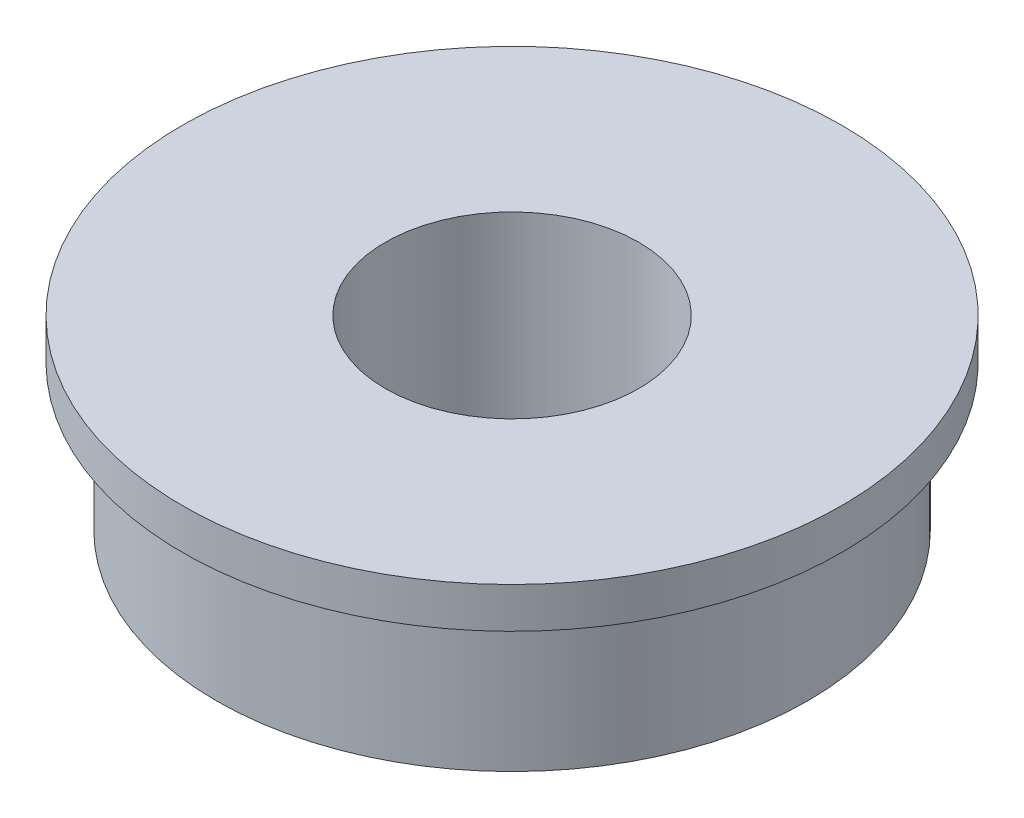
ISO-10303-21;
HEADER;
FILE_DESCRIPTION(('STEP AP214'),'2;1');
FILE_NAME('part.step','',(''),(''),'','','');
FILE_SCHEMA(('AUTOMOTIVE_DESIGN { 1 0 10303 214 1 1 1 1 }'));
ENDSEC;
DATA;
#1=APPLICATION_CONTEXT('core data for automotive mechanical design processes');
#2=APPLICATION_PROTOCOL_DEFINITION('international standard','automotive_design',2000,#1);
#3=PRODUCT_CONTEXT('',#1,'mechanical');
#4=PRODUCT('Part','Part','',(#3));
#5=PRODUCT_RELATED_PRODUCT_CATEGORY('part','',(#4));
#6=PRODUCT_DEFINITION_FORMATION('','',#4);
#7=PRODUCT_DEFINITION_CONTEXT('part definition',#1,'design');
#8=PRODUCT_DEFINITION('design','',#6,#7);
#9=PRODUCT_DEFINITION_SHAPE('','',#8);
#10=(LENGTH_UNIT() NAMED_UNIT(*) SI_UNIT(.MILLI.,.METRE.));
#11=(NAMED_UNIT(*) PLANE_ANGLE_UNIT() SI_UNIT($,.RADIAN.));
#12=(NAMED_UNIT(*) SI_UNIT($,.STERADIAN.) SOLID_ANGLE_UNIT());
#13=UNCERTAINTY_MEASURE_WITH_UNIT(LENGTH_MEASURE(1.E-05),#10,'distance_accuracy_value','');
#14=(GEOMETRIC_REPRESENTATION_CONTEXT(3) GLOBAL_UNCERTAINTY_ASSIGNED_CONTEXT((#13)) GLOBAL_UNIT_ASSIGNED_CONTEXT((#10,
#11,#12)) REPRESENTATION_CONTEXT('',''));
#15=CARTESIAN_POINT('',(0.,0.,0.));
#16=DIRECTION('',(0.,0.,1.));
#17=DIRECTION('',(1.,0.,0.));
#18=AXIS2_PLACEMENT_3D('',#15,#16,#17);
#19=CARTESIAN_POINT('',(-11.5886380489201,5.461,0.));
#20=DIRECTION('',(0.,-1.,0.));
#21=DIRECTION('',(0.,0.,-1.));
#22=AXIS2_PLACEMENT_3D('',#19,#20,#21);
#23=CYLINDRICAL_SURFACE('',#22,11.1125);
#24=CARTESIAN_POINT('',(-11.5886380489201,5.461,0.));
#25=DIRECTION('',(0.,1.,0.));
#26=DIRECTION('',(0.,0.,1.));
#27=AXIS2_PLACEMENT_3D('',#24,#25,#26);
#28=CIRCLE('',#27,11.1125);
#29=CARTESIAN_POINT('',(-11.5886380489201,5.461,11.1125));
#30=VERTEX_POINT('',#29);
#31=EDGE_CURVE('E10',#30,#30,#28,.T.);
#32=ORIENTED_EDGE('',*,*,#31,.F.);
#33=EDGE_LOOP('',(#32));
#34=FACE_BOUND('',#33,.T.);
#35=CARTESIAN_POINT('',(-11.5886380489201,0.,0.));
#36=DIRECTION('',(0.,1.,0.));
#37=DIRECTION('',(0.,0.,1.));
#38=AXIS2_PLACEMENT_3D('',#35,#36,#37);
#39=CIRCLE('',#38,11.1125);
#40=CARTESIAN_POINT('',(-11.5886380489201,0.,11.1125));
#41=VERTEX_POINT('',#40);
#42=EDGE_CURVE('E34',#41,#41,#39,.T.);
#43=ORIENTED_EDGE('',*,*,#42,.T.);
#44=EDGE_LOOP('',(#43));
#45=FACE_BOUND('',#44,.T.);
#46=ADVANCED_FACE('F31',(#34,#45),#23,.T.);
#47=CARTESIAN_POINT('',(-11.5886380489201,0.,0.));
#48=DIRECTION('',(0.,1.,0.));
#49=DIRECTION('',(0.,0.,1.));
#50=AXIS2_PLACEMENT_3D('',#47,#48,#49);
#51=PLANE('',#50);
#52=CARTESIAN_POINT('',(-11.5886380489201,0.,0.));
#53=DIRECTION('',(0.,1.,0.));
#54=DIRECTION('',(0.,0.,1.));
#55=AXIS2_PLACEMENT_3D('',#52,#53,#54);
#56=CIRCLE('',#55,4.7625);
#57=CARTESIAN_POINT('',(-11.5886380489201,0.,4.7625));
#58=VERTEX_POINT('',#57);
#59=EDGE_CURVE('E46',#58,#58,#56,.T.);
#60=ORIENTED_EDGE('',*,*,#59,.T.);
#61=EDGE_LOOP('',(#60));
#62=FACE_BOUND('',#61,.T.);
#63=ORIENTED_EDGE('',*,*,#42,.F.);
#64=EDGE_LOOP('',(#63));
#65=FACE_BOUND('',#64,.T.);
#66=ADVANCED_FACE('F72',(#62,#65),#51,.F.);
#67=CARTESIAN_POINT('',(-11.5886380489201,5.461,0.));
#68=DIRECTION('',(0.,1.,0.));
#69=DIRECTION('',(0.,0.,1.));
#70=AXIS2_PLACEMENT_3D('',#67,#68,#69);
#71=PLANE('',#70);
#72=CARTESIAN_POINT('',(-11.5886380489201,5.461,0.));
#73=DIRECTION('',(0.,1.,0.));
#74=DIRECTION('',(0.,0.,1.));
#75=AXIS2_PLACEMENT_3D('',#72,#73,#74);
#76=CIRCLE('',#75,12.3825);
#77=CARTESIAN_POINT('',(-11.5886380489201,5.461,-12.3825));
#78=VERTEX_POINT('',#77);
#79=EDGE_CURVE('E43',#78,#78,#76,.T.);
#80=ORIENTED_EDGE('',*,*,#79,.F.);
#81=EDGE_LOOP('',(#80));
#82=FACE_BOUND('',#81,.T.);
#83=ORIENTED_EDGE('',*,*,#31,.T.);
#84=EDGE_LOOP('',(#83));
#85=FACE_BOUND('',#84,.T.);
#86=ADVANCED_FACE('F67',(#82,#85),#71,.F.);
#87=CARTESIAN_POINT('',(-11.5886380489201,6.985,0.));
#88=DIRECTION('',(0.,-1.,0.));
#89=DIRECTION('',(0.,0.,-1.));
#90=AXIS2_PLACEMENT_3D('',#87,#88,#89);
#91=CYLINDRICAL_SURFACE('',#90,12.3825);
#92=CARTESIAN_POINT('',(-11.5886380489201,6.985,0.));
#93=DIRECTION('',(0.,1.,0.));
#94=DIRECTION('',(0.,0.,1.));
#95=AXIS2_PLACEMENT_3D('',#92,#93,#94);
#96=CIRCLE('',#95,12.3825);
#97=CARTESIAN_POINT('',(-11.5886380489201,6.985,-12.3825));
#98=VERTEX_POINT('',#97);
#99=EDGE_CURVE('E41',#98,#98,#96,.T.);
#100=CARTESIAN_POINT('',(-11.5886380489201,6.985,-12.3825));
#101=CARTESIAN_POINT('',(-11.5886380489201,6.969125,-12.3825));
#102=CARTESIAN_POINT('',(-11.5886380489201,6.95325,-12.3825));
#103=CARTESIAN_POINT('',(-11.5886380489201,6.9215,-12.3825));
#104=CARTESIAN_POINT('',(-11.5886380489201,6.905625,-12.3825));
#105=CARTESIAN_POINT('',(-11.5886380489201,6.873875,-12.3825));
#106=CARTESIAN_POINT('',(-11.5886380489201,6.858,-12.3825));
#107=CARTESIAN_POINT('',(-11.5886380489201,6.82625,-12.3825));
#108=CARTESIAN_POINT('',(-11.5886380489201,6.810375,-12.3825));
#109=CARTESIAN_POINT('',(-11.5886380489201,6.778625,-12.3825));
#110=CARTESIAN_POINT('',(-11.5886380489201,6.76275,-12.3825));
#111=CARTESIAN_POINT('',(-11.5886380489201,6.731,-12.3825));
#112=CARTESIAN_POINT('',(-11.5886380489201,6.715125,-12.3825));
#113=CARTESIAN_POINT('',(-11.5886380489201,6.683375,-12.3825));
#114=CARTESIAN_POINT('',(-11.5886380489201,6.6675,-12.3825));
#115=CARTESIAN_POINT('',(-11.5886380489201,6.63575,-12.3825));
#116=CARTESIAN_POINT('',(-11.5886380489201,6.619875,-12.3825));
#117=CARTESIAN_POINT('',(-11.5886380489201,6.588125,-12.3825));
#118=CARTESIAN_POINT('',(-11.5886380489201,6.57225,-12.3825));
#119=CARTESIAN_POINT('',(-11.5886380489201,6.5405,-12.3825));
#120=CARTESIAN_POINT('',(-11.5886380489201,6.524625,-12.3825));
#121=CARTESIAN_POINT('',(-11.5886380489201,6.492875,-12.3825));
#122=CARTESIAN_POINT('',(-11.5886380489201,6.477,-12.3825));
#123=CARTESIAN_POINT('',(-11.5886380489201,6.44525,-12.3825));
#124=CARTESIAN_POINT('',(-11.5886380489201,6.429375,-12.3825));
#125=CARTESIAN_POINT('',(-11.5886380489201,6.397625,-12.3825));
#126=CARTESIAN_POINT('',(-11.5886380489201,6.38175,-12.3825));
#127=CARTESIAN_POINT('',(-11.5886380489201,6.35,-12.3825));
#128=CARTESIAN_POINT('',(-11.5886380489201,6.334125,-12.3825));
#129=CARTESIAN_POINT('',(-11.5886380489201,6.302375,-12.3825));
#130=CARTESIAN_POINT('',(-11.5886380489201,6.2865,-12.3825));
#131=CARTESIAN_POINT('',(-11.5886380489201,6.25475,-12.3825));
#132=CARTESIAN_POINT('',(-11.5886380489201,6.238875,-12.3825));
#133=CARTESIAN_POINT('',(-11.5886380489201,6.207125,-12.3825));
#134=CARTESIAN_POINT('',(-11.5886380489201,6.19125,-12.3825));
#135=CARTESIAN_POINT('',(-11.5886380489201,6.1595,-12.3825));
#136=CARTESIAN_POINT('',(-11.5886380489201,6.143625,-12.3825));
#137=CARTESIAN_POINT('',(-11.5886380489201,6.111875,-12.3825));
#138=CARTESIAN_POINT('',(-11.5886380489201,6.096,-12.3825));
#139=CARTESIAN_POINT('',(-11.5886380489201,6.06425,-12.3825));
#140=CARTESIAN_POINT('',(-11.5886380489201,6.048375,-12.3825));
#141=CARTESIAN_POINT('',(-11.5886380489201,6.016625,-12.3825));
#142=CARTESIAN_POINT('',(-11.5886380489201,6.00075,-12.3825));
#143=CARTESIAN_POINT('',(-11.5886380489201,5.969,-12.3825));
#144=CARTESIAN_POINT('',(-11.5886380489201,5.953125,-12.3825));
#145=CARTESIAN_POINT('',(-11.5886380489201,5.921375,-12.3825));
#146=CARTESIAN_POINT('',(-11.5886380489201,5.9055,-12.3825));
#147=CARTESIAN_POINT('',(-11.5886380489201,5.87375,-12.3825));
#148=CARTESIAN_POINT('',(-11.5886380489201,5.857875,-12.3825));
#149=CARTESIAN_POINT('',(-11.5886380489201,5.826125,-12.3825));
#150=CARTESIAN_POINT('',(-11.5886380489201,5.81025,-12.3825));
#151=CARTESIAN_POINT('',(-11.5886380489201,5.7785,-12.3825));
#152=CARTESIAN_POINT('',(-11.5886380489201,5.762625,-12.3825));
#153=CARTESIAN_POINT('',(-11.5886380489201,5.730875,-12.3825));
#154=CARTESIAN_POINT('',(-11.5886380489201,5.715,-12.3825));
#155=CARTESIAN_POINT('',(-11.5886380489201,5.68325,-12.3825));
#156=CARTESIAN_POINT('',(-11.5886380489201,5.667375,-12.3825));
#157=CARTESIAN_POINT('',(-11.5886380489201,5.635625,-12.3825));
#158=CARTESIAN_POINT('',(-11.5886380489201,5.61975,-12.3825));
#159=CARTESIAN_POINT('',(-11.5886380489201,5.588,-12.3825));
#160=CARTESIAN_POINT('',(-11.5886380489201,5.572125,-12.3825));
#161=CARTESIAN_POINT('',(-11.5886380489201,5.540375,-12.3825));
#162=CARTESIAN_POINT('',(-11.5886380489201,5.5245,-12.3825));
#163=CARTESIAN_POINT('',(-11.5886380489201,5.49275,-12.3825));
#164=CARTESIAN_POINT('',(-11.5886380489201,5.476875,-12.3825));
#165=CARTESIAN_POINT('',(-11.5886380489201,5.461,-12.3825));
#166=B_SPLINE_CURVE_WITH_KNOTS('',3,(#100,#101,#102,#103,#104,#105,#106,#107,#108,#109,#110,
#111,#112,#113,#114,#115,#116,#117,#118,#119,#120,#121,#122,#123,#124,#125,#126,#127,#128,#129,
#130,#131,#132,#133,#134,#135,#136,#137,#138,#139,#140,#141,#142,#143,#144,#145,#146,#147,#148,
#149,#150,#151,#152,#153,#154,#155,#156,#157,#158,#159,#160,#161,#162,#163,#164,#165),
.UNSPECIFIED.,.F.,.F.,(4,2,2,2,2,2,2,2,2,2,2,2,2,2,2,2,2,2,2,2,2,2,2,2,2,2,2,2,2,2,2,2,4),(0.,
0.0476250000000008,0.0952500000000007,0.142875000000001,0.190500000000001,0.238125,0.28575,
0.333375,0.381,0.428625,0.47625,0.523875,0.571500000000001,0.619125000000001,0.666750000000001,
0.714375000000001,0.762000000000001,0.809625,0.85725,0.904875,0.9525,1.000125,1.04775,1.095375,
1.143,1.190625,1.23825,1.285875,1.3335,1.381125,1.42875,1.476375,1.524),.UNSPECIFIED.);
#167=EDGE_CURVE('BSEAM61',#98,#78,#166,.T.);
#168=ORIENTED_EDGE('',*,*,#99,.F.);
#169=ORIENTED_EDGE('',*,*,#79,.T.);
#170=ORIENTED_EDGE('',*,*,#167,.T.);
#171=ORIENTED_EDGE('',*,*,#167,.F.);
#172=EDGE_LOOP('',(#168,#170,#169,#171));
#173=FACE_BOUND('',#172,.T.);
#174=ADVANCED_FACE('F61',(#173),#91,.T.);
#175=CARTESIAN_POINT('',(-11.5886380489201,6.985,0.));
#176=DIRECTION('',(0.,1.,0.));
#177=DIRECTION('',(0.,0.,1.));
#178=AXIS2_PLACEMENT_3D('',#175,#176,#177);
#179=PLANE('',#178);
#180=CARTESIAN_POINT('',(-11.5886380489201,6.985,0.));
#181=DIRECTION('',(0.,1.,0.));
#182=DIRECTION('',(0.,0.,1.));
#183=AXIS2_PLACEMENT_3D('',#180,#181,#182);
#184=CIRCLE('',#183,4.7625);
#185=CARTESIAN_POINT('',(-11.5886380489201,6.985,4.7625));
#186=VERTEX_POINT('',#185);
#187=EDGE_CURVE('E51',#186,#186,#184,.T.);
#188=ORIENTED_EDGE('',*,*,#187,.F.);
#189=EDGE_LOOP('',(#188));
#190=FACE_BOUND('',#189,.T.);
#191=ORIENTED_EDGE('',*,*,#99,.T.);
#192=EDGE_LOOP('',(#191));
#193=FACE_BOUND('',#192,.T.);
#194=ADVANCED_FACE('F58',(#190,#193),#179,.T.);
#195=CARTESIAN_POINT('',(-11.5886380489201,-9.779,0.));
#196=DIRECTION('',(0.,1.,0.));
#197=DIRECTION('',(0.,0.,1.));
#198=AXIS2_PLACEMENT_3D('',#195,#196,#197);
#199=CYLINDRICAL_SURFACE('',#198,4.7625);
#200=ORIENTED_EDGE('',*,*,#187,.T.);
#201=EDGE_LOOP('',(#200));
#202=FACE_BOUND('',#201,.T.);
#203=ORIENTED_EDGE('',*,*,#59,.F.);
#204=EDGE_LOOP('',(#203));
#205=FACE_BOUND('',#204,.T.);
#206=ADVANCED_FACE('F55',(#202,#205),#199,.F.);
#207=CLOSED_SHELL('',(#46,#66,#86,#174,#194,#206));
#208=MANIFOLD_SOLID_BREP('B2',#207);
#209=ADVANCED_BREP_SHAPE_REPRESENTATION('',(#18,#208),#14);
#210=SHAPE_DEFINITION_REPRESENTATION(#9,#209);
ENDSEC;
END-ISO-10303-21;
